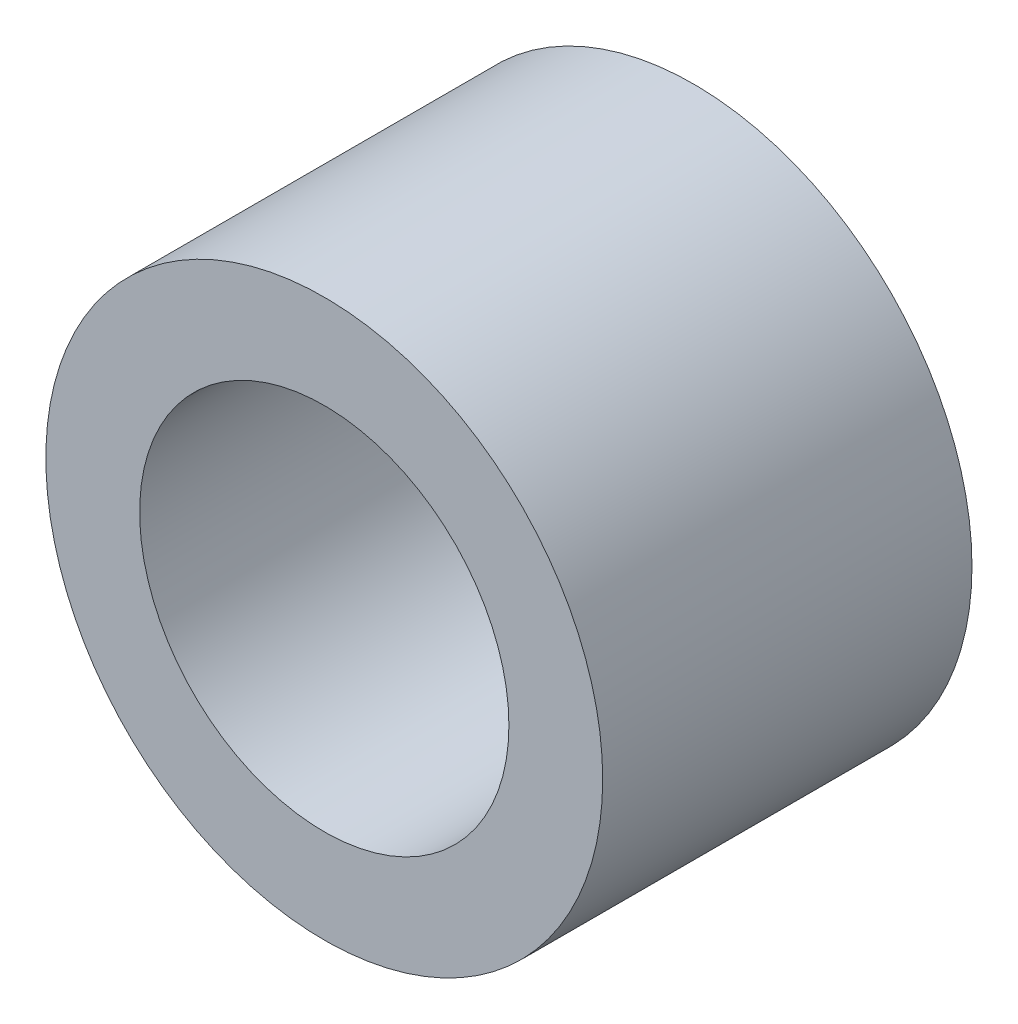
ISO-10303-21;
HEADER;
FILE_DESCRIPTION(('STEP AP214'),'2;1');
FILE_NAME('part.step','',(''),(''),'','','');
FILE_SCHEMA(('AUTOMOTIVE_DESIGN { 1 0 10303 214 1 1 1 1 }'));
ENDSEC;
DATA;
#1=APPLICATION_CONTEXT('core data for automotive mechanical design processes');
#2=APPLICATION_PROTOCOL_DEFINITION('international standard','automotive_design',2000,#1);
#3=PRODUCT_CONTEXT('',#1,'mechanical');
#4=PRODUCT('Part','Part','',(#3));
#5=PRODUCT_RELATED_PRODUCT_CATEGORY('part','',(#4));
#6=PRODUCT_DEFINITION_FORMATION('','',#4);
#7=PRODUCT_DEFINITION_CONTEXT('part definition',#1,'design');
#8=PRODUCT_DEFINITION('design','',#6,#7);
#9=PRODUCT_DEFINITION_SHAPE('','',#8);
#10=(LENGTH_UNIT() NAMED_UNIT(*) SI_UNIT(.MILLI.,.METRE.));
#11=(NAMED_UNIT(*) PLANE_ANGLE_UNIT() SI_UNIT($,.RADIAN.));
#12=(NAMED_UNIT(*) SI_UNIT($,.STERADIAN.) SOLID_ANGLE_UNIT());
#13=UNCERTAINTY_MEASURE_WITH_UNIT(LENGTH_MEASURE(1.E-05),#10,'distance_accuracy_value','');
#14=(GEOMETRIC_REPRESENTATION_CONTEXT(3) GLOBAL_UNCERTAINTY_ASSIGNED_CONTEXT((#13)) GLOBAL_UNIT_ASSIGNED_CONTEXT((#10,
#11,#12)) REPRESENTATION_CONTEXT('',''));
#15=CARTESIAN_POINT('',(0.,0.,0.));
#16=DIRECTION('',(0.,0.,1.));
#17=DIRECTION('',(1.,0.,0.));
#18=AXIS2_PLACEMENT_3D('',#15,#16,#17);
#19=CARTESIAN_POINT('',(0.,0.,3.175));
#20=DIRECTION('',(0.,0.,1.));
#21=DIRECTION('',(1.,0.,0.));
#22=AXIS2_PLACEMENT_3D('',#19,#20,#21);
#23=PLANE('',#22);
#24=CARTESIAN_POINT('',(0.,0.,3.175));
#25=DIRECTION('',(0.,0.,1.));
#26=DIRECTION('',(1.,0.,0.));
#27=AXIS2_PLACEMENT_3D('',#24,#25,#26);
#28=CIRCLE('',#27,4.7879);
#29=CARTESIAN_POINT('',(4.7879,0.,3.175));
#30=VERTEX_POINT('',#29);
#31=EDGE_CURVE('E10',#30,#30,#28,.T.);
#32=ORIENTED_EDGE('',*,*,#31,.T.);
#33=EDGE_LOOP('',(#32));
#34=FACE_BOUND('',#33,.T.);
#35=CARTESIAN_POINT('',(0.,0.,3.175));
#36=DIRECTION('',(0.,0.,1.));
#37=DIRECTION('',(1.,0.,0.));
#38=AXIS2_PLACEMENT_3D('',#35,#36,#37);
#39=CIRCLE('',#38,3.175);
#40=CARTESIAN_POINT('',(3.175,0.,3.175));
#41=VERTEX_POINT('',#40);
#42=EDGE_CURVE('E44',#41,#41,#39,.T.);
#43=ORIENTED_EDGE('',*,*,#42,.F.);
#44=EDGE_LOOP('',(#43));
#45=FACE_BOUND('',#44,.T.);
#46=ADVANCED_FACE('F33',(#34,#45),#23,.T.);
#47=CARTESIAN_POINT('',(0.,0.,-3.175));
#48=DIRECTION('',(0.,0.,1.));
#49=DIRECTION('',(1.,0.,0.));
#50=AXIS2_PLACEMENT_3D('',#47,#48,#49);
#51=PLANE('',#50);
#52=CARTESIAN_POINT('',(0.,0.,-3.175));
#53=DIRECTION('',(0.,0.,1.));
#54=DIRECTION('',(1.,0.,0.));
#55=AXIS2_PLACEMENT_3D('',#52,#53,#54);
#56=CIRCLE('',#55,4.7879);
#57=CARTESIAN_POINT('',(4.7879,0.,-3.175));
#58=VERTEX_POINT('',#57);
#59=EDGE_CURVE('E37',#58,#58,#56,.T.);
#60=ORIENTED_EDGE('',*,*,#59,.F.);
#61=EDGE_LOOP('',(#60));
#62=FACE_BOUND('',#61,.T.);
#63=CARTESIAN_POINT('',(0.,0.,-3.175));
#64=DIRECTION('',(0.,0.,1.));
#65=DIRECTION('',(1.,0.,0.));
#66=AXIS2_PLACEMENT_3D('',#63,#64,#65);
#67=CIRCLE('',#66,3.175);
#68=CARTESIAN_POINT('',(3.175,0.,-3.175));
#69=VERTEX_POINT('',#68);
#70=EDGE_CURVE('E46',#69,#69,#67,.T.);
#71=ORIENTED_EDGE('',*,*,#70,.T.);
#72=EDGE_LOOP('',(#71));
#73=FACE_BOUND('',#72,.T.);
#74=ADVANCED_FACE('F56',(#62,#73),#51,.F.);
#75=CARTESIAN_POINT('',(0.,0.,3.175));
#76=DIRECTION('',(0.,0.,-1.));
#77=DIRECTION('',(-1.,0.,0.));
#78=AXIS2_PLACEMENT_3D('',#75,#76,#77);
#79=CYLINDRICAL_SURFACE('',#78,4.7879);
#80=ORIENTED_EDGE('',*,*,#31,.F.);
#81=EDGE_LOOP('',(#80));
#82=FACE_BOUND('',#81,.T.);
#83=ORIENTED_EDGE('',*,*,#59,.T.);
#84=EDGE_LOOP('',(#83));
#85=FACE_BOUND('',#84,.T.);
#86=ADVANCED_FACE('F35',(#82,#85),#79,.T.);
#87=CARTESIAN_POINT('',(0.,0.,3.175));
#88=DIRECTION('',(0.,0.,-1.));
#89=DIRECTION('',(-1.,0.,0.));
#90=AXIS2_PLACEMENT_3D('',#87,#88,#89);
#91=CYLINDRICAL_SURFACE('',#90,3.175);
#92=ORIENTED_EDGE('',*,*,#42,.T.);
#93=EDGE_LOOP('',(#92));
#94=FACE_BOUND('',#93,.T.);
#95=ORIENTED_EDGE('',*,*,#70,.F.);
#96=EDGE_LOOP('',(#95));
#97=FACE_BOUND('',#96,.T.);
#98=ADVANCED_FACE('F52',(#94,#97),#91,.F.);
#99=CLOSED_SHELL('',(#46,#74,#86,#98));
#100=MANIFOLD_SOLID_BREP('B2',#99);
#101=ADVANCED_BREP_SHAPE_REPRESENTATION('',(#18,#100),#14);
#102=SHAPE_DEFINITION_REPRESENTATION(#9,#101);
ENDSEC;
END-ISO-10303-21;
